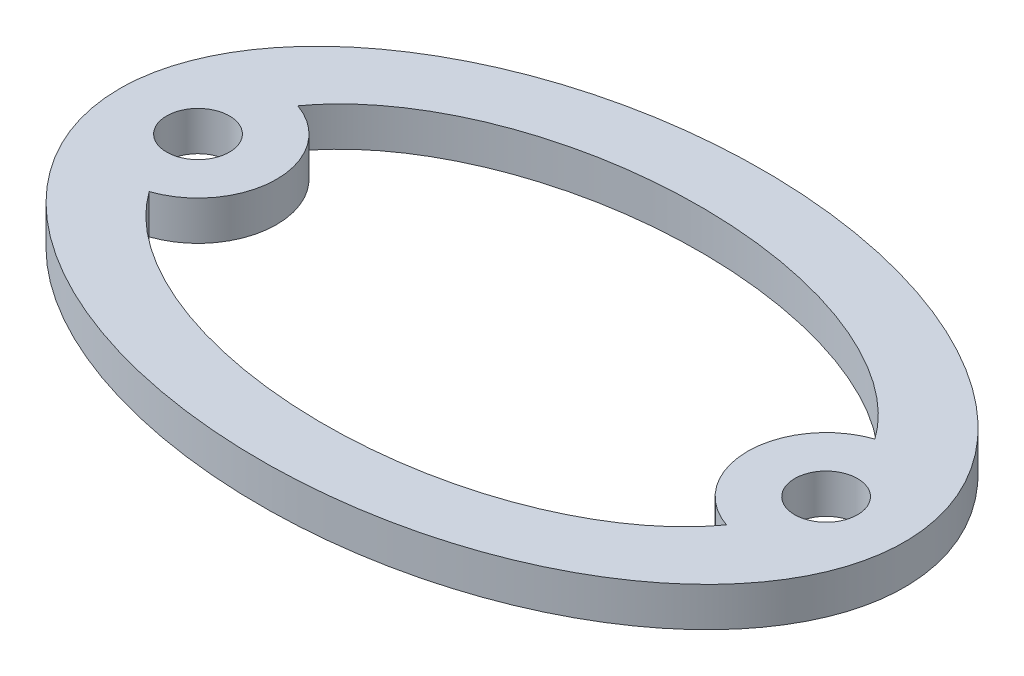
ISO-10303-21;
HEADER;
FILE_DESCRIPTION(('STEP AP214'),'2;1');
FILE_NAME('part.step','',(''),(''),'','','');
FILE_SCHEMA(('AUTOMOTIVE_DESIGN { 1 0 10303 214 1 1 1 1 }'));
ENDSEC;
DATA;
#1=APPLICATION_CONTEXT('core data for automotive mechanical design processes');
#2=APPLICATION_PROTOCOL_DEFINITION('international standard','automotive_design',2000,#1);
#3=PRODUCT_CONTEXT('',#1,'mechanical');
#4=PRODUCT('Part','Part','',(#3));
#5=PRODUCT_RELATED_PRODUCT_CATEGORY('part','',(#4));
#6=PRODUCT_DEFINITION_FORMATION('','',#4);
#7=PRODUCT_DEFINITION_CONTEXT('part definition',#1,'design');
#8=PRODUCT_DEFINITION('design','',#6,#7);
#9=PRODUCT_DEFINITION_SHAPE('','',#8);
#10=(LENGTH_UNIT() NAMED_UNIT(*) SI_UNIT(.MILLI.,.METRE.));
#11=(NAMED_UNIT(*) PLANE_ANGLE_UNIT() SI_UNIT($,.RADIAN.));
#12=(NAMED_UNIT(*) SI_UNIT($,.STERADIAN.) SOLID_ANGLE_UNIT());
#13=UNCERTAINTY_MEASURE_WITH_UNIT(LENGTH_MEASURE(1.E-05),#10,'distance_accuracy_value','');
#14=(GEOMETRIC_REPRESENTATION_CONTEXT(3) GLOBAL_UNCERTAINTY_ASSIGNED_CONTEXT((#13)) GLOBAL_UNIT_ASSIGNED_CONTEXT((#10,
#11,#12)) REPRESENTATION_CONTEXT('',''));
#15=CARTESIAN_POINT('',(0.,0.,0.));
#16=DIRECTION('',(0.,0.,1.));
#17=DIRECTION('',(1.,0.,0.));
#18=AXIS2_PLACEMENT_3D('',#15,#16,#17);
#19=CARTESIAN_POINT('',(0.,2.5,0.));
#20=DIRECTION('',(0.,1.,0.));
#21=DIRECTION('',(1.,0.,0.));
#22=AXIS2_PLACEMENT_3D('',#19,#20,#21);
#23=ELLIPSE('',#22,20.,12.);
#24=DIRECTION('',(0.,-1.,0.));
#25=VECTOR('',#24,1.);
#26=SURFACE_OF_LINEAR_EXTRUSION('',#23,#25);
#27=CARTESIAN_POINT('',(0.,0.,0.));
#28=DIRECTION('',(0.,1.,0.));
#29=DIRECTION('',(1.,0.,0.));
#30=AXIS2_PLACEMENT_3D('',#27,#28,#29);
#31=ELLIPSE('',#30,20.,12.);
#32=CARTESIAN_POINT('',(18.3804623237662,0.,-4.7304437123022));
#33=VERTEX_POINT('',#32);
#34=CARTESIAN_POINT('',(-18.3804623237662,0.,-4.7304437123022));
#35=VERTEX_POINT('',#34);
#36=EDGE_CURVE('E139',#33,#35,#31,.T.);
#37=ORIENTED_EDGE('',*,*,#36,.F.);
#38=DIRECTION('',(0.,-1.,0.));
#39=VECTOR('',#38,1.);
#40=CARTESIAN_POINT('',(18.3804623237662,2.5,-4.7304437123022));
#41=LINE('',#40,#39);
#42=CARTESIAN_POINT('',(18.3804623237662,2.5,-4.7304437123022));
#43=VERTEX_POINT('',#42);
#44=EDGE_CURVE('E11',#43,#33,#41,.T.);
#45=ORIENTED_EDGE('',*,*,#44,.F.);
#46=CARTESIAN_POINT('',(-18.3804623237662,2.5,-4.7304437123022));
#47=VERTEX_POINT('',#46);
#48=EDGE_CURVE('E90',#43,#47,#23,.T.);
#49=ORIENTED_EDGE('',*,*,#48,.T.);
#50=DIRECTION('',(0.,-1.,0.));
#51=VECTOR('',#50,1.);
#52=CARTESIAN_POINT('',(-18.3804623237662,2.5,-4.7304437123022));
#53=LINE('',#52,#51);
#54=EDGE_CURVE('E57',#47,#35,#53,.T.);
#55=ORIENTED_EDGE('',*,*,#54,.T.);
#56=EDGE_LOOP('',(#37,#45,#49,#55));
#57=FACE_BOUND('',#56,.T.);
#58=ADVANCED_FACE('F39',(#57),#26,.T.);
#59=CARTESIAN_POINT('',(20.,2.5,0.));
#60=DIRECTION('',(0.,-1.,0.));
#61=DIRECTION('',(0.,0.,-1.));
#62=AXIS2_PLACEMENT_3D('',#59,#60,#61);
#63=CYLINDRICAL_SURFACE('',#62,5.);
#64=CARTESIAN_POINT('',(20.,0.,0.));
#65=DIRECTION('',(0.,1.,0.));
#66=DIRECTION('',(0.,0.,1.));
#67=AXIS2_PLACEMENT_3D('',#64,#65,#66);
#68=CIRCLE('',#67,5.);
#69=CARTESIAN_POINT('',(18.3804623237662,0.,4.7304437123022));
#70=VERTEX_POINT('',#69);
#71=EDGE_CURVE('E96',#33,#70,#68,.T.);
#72=ORIENTED_EDGE('',*,*,#71,.T.);
#73=DIRECTION('',(0.,-1.,0.));
#74=VECTOR('',#73,1.);
#75=CARTESIAN_POINT('',(18.3804623237662,2.5,4.7304437123022));
#76=LINE('',#75,#74);
#77=CARTESIAN_POINT('',(18.3804623237662,2.5,4.7304437123022));
#78=VERTEX_POINT('',#77);
#79=EDGE_CURVE('E49',#78,#70,#76,.T.);
#80=ORIENTED_EDGE('',*,*,#79,.F.);
#81=CARTESIAN_POINT('',(20.,2.5,0.));
#82=DIRECTION('',(0.,1.,0.));
#83=DIRECTION('',(0.,0.,1.));
#84=AXIS2_PLACEMENT_3D('',#81,#82,#83);
#85=CIRCLE('',#84,5.);
#86=EDGE_CURVE('E83',#43,#78,#85,.T.);
#87=ORIENTED_EDGE('',*,*,#86,.F.);
#88=ORIENTED_EDGE('',*,*,#44,.T.);
#89=EDGE_LOOP('',(#72,#80,#87,#88));
#90=FACE_BOUND('',#89,.T.);
#91=ADVANCED_FACE('F41',(#90),#63,.T.);
#92=CARTESIAN_POINT('',(-18.3804623237662,0.,4.7304437123022));
#93=VERTEX_POINT('',#92);
#94=EDGE_CURVE('E169',#93,#70,#31,.T.);
#95=ORIENTED_EDGE('',*,*,#94,.F.);
#96=DIRECTION('',(0.,-1.,0.));
#97=VECTOR('',#96,1.);
#98=CARTESIAN_POINT('',(-18.3804623237662,2.5,4.7304437123022));
#99=LINE('',#98,#97);
#100=CARTESIAN_POINT('',(-18.3804623237662,2.5,4.7304437123022));
#101=VERTEX_POINT('',#100);
#102=EDGE_CURVE('E70',#101,#93,#99,.T.);
#103=ORIENTED_EDGE('',*,*,#102,.F.);
#104=EDGE_CURVE('E89',#101,#78,#23,.T.);
#105=ORIENTED_EDGE('',*,*,#104,.T.);
#106=ORIENTED_EDGE('',*,*,#79,.T.);
#107=EDGE_LOOP('',(#95,#103,#105,#106));
#108=FACE_BOUND('',#107,.T.);
#109=ADVANCED_FACE('F100',(#108),#26,.T.);
#110=CARTESIAN_POINT('',(20.,2.5,0.));
#111=DIRECTION('',(0.,-1.,0.));
#112=DIRECTION('',(0.,0.,-1.));
#113=AXIS2_PLACEMENT_3D('',#110,#111,#112);
#114=CYLINDRICAL_SURFACE('',#113,2.);
#115=CARTESIAN_POINT('',(20.,2.5,0.));
#116=DIRECTION('',(0.,1.,0.));
#117=DIRECTION('',(0.,0.,1.));
#118=AXIS2_PLACEMENT_3D('',#115,#116,#117);
#119=CIRCLE('',#118,2.);
#120=CARTESIAN_POINT('',(20.,2.5,2.));
#121=VERTEX_POINT('',#120);
#122=EDGE_CURVE('E129',#121,#121,#119,.T.);
#123=ORIENTED_EDGE('',*,*,#122,.T.);
#124=EDGE_LOOP('',(#123));
#125=FACE_BOUND('',#124,.T.);
#126=CARTESIAN_POINT('',(20.,0.,0.));
#127=DIRECTION('',(0.,1.,0.));
#128=DIRECTION('',(0.,0.,1.));
#129=AXIS2_PLACEMENT_3D('',#126,#127,#128);
#130=CIRCLE('',#129,2.);
#131=CARTESIAN_POINT('',(20.,0.,2.));
#132=VERTEX_POINT('',#131);
#133=EDGE_CURVE('E112',#132,#132,#130,.T.);
#134=ORIENTED_EDGE('',*,*,#133,.F.);
#135=EDGE_LOOP('',(#134));
#136=FACE_BOUND('',#135,.T.);
#137=ADVANCED_FACE('F150',(#125,#136),#114,.F.);
#138=CARTESIAN_POINT('',(-20.,2.5,0.));
#139=DIRECTION('',(0.,-1.,0.));
#140=DIRECTION('',(0.,0.,-1.));
#141=AXIS2_PLACEMENT_3D('',#138,#139,#140);
#142=CYLINDRICAL_SURFACE('',#141,2.);
#143=CARTESIAN_POINT('',(-20.,2.5,0.));
#144=DIRECTION('',(0.,1.,0.));
#145=DIRECTION('',(0.,0.,1.));
#146=AXIS2_PLACEMENT_3D('',#143,#144,#145);
#147=CIRCLE('',#146,2.);
#148=CARTESIAN_POINT('',(-20.,2.5,2.));
#149=VERTEX_POINT('',#148);
#150=EDGE_CURVE('E105',#149,#149,#147,.F.);
#151=ORIENTED_EDGE('',*,*,#150,.F.);
#152=EDGE_LOOP('',(#151));
#153=FACE_BOUND('',#152,.T.);
#154=CARTESIAN_POINT('',(-20.,0.,0.));
#155=DIRECTION('',(0.,1.,0.));
#156=DIRECTION('',(0.,0.,1.));
#157=AXIS2_PLACEMENT_3D('',#154,#155,#156);
#158=CIRCLE('',#157,2.);
#159=CARTESIAN_POINT('',(-20.,0.,2.));
#160=VERTEX_POINT('',#159);
#161=EDGE_CURVE('E118',#160,#160,#158,.F.);
#162=ORIENTED_EDGE('',*,*,#161,.T.);
#163=EDGE_LOOP('',(#162));
#164=FACE_BOUND('',#163,.T.);
#165=ADVANCED_FACE('F153',(#153,#164),#142,.F.);
#166=CARTESIAN_POINT('',(-20.,2.5,0.));
#167=DIRECTION('',(0.,-1.,0.));
#168=DIRECTION('',(0.,0.,-1.));
#169=AXIS2_PLACEMENT_3D('',#166,#167,#168);
#170=CYLINDRICAL_SURFACE('',#169,5.);
#171=CARTESIAN_POINT('',(-20.,0.,0.));
#172=DIRECTION('',(0.,1.,0.));
#173=DIRECTION('',(0.,0.,1.));
#174=AXIS2_PLACEMENT_3D('',#171,#172,#173);
#175=CIRCLE('',#174,5.);
#176=EDGE_CURVE('E172',#35,#93,#175,.F.);
#177=ORIENTED_EDGE('',*,*,#176,.F.);
#178=ORIENTED_EDGE('',*,*,#54,.F.);
#179=CARTESIAN_POINT('',(-20.,2.5,0.));
#180=DIRECTION('',(0.,1.,0.));
#181=DIRECTION('',(0.,0.,1.));
#182=AXIS2_PLACEMENT_3D('',#179,#180,#181);
#183=CIRCLE('',#182,5.);
#184=EDGE_CURVE('E102',#47,#101,#183,.F.);
#185=ORIENTED_EDGE('',*,*,#184,.T.);
#186=ORIENTED_EDGE('',*,*,#102,.T.);
#187=EDGE_LOOP('',(#177,#178,#185,#186));
#188=FACE_BOUND('',#187,.T.);
#189=ADVANCED_FACE('F146',(#188),#170,.T.);
#190=CARTESIAN_POINT('',(0.,2.5,0.));
#191=DIRECTION('',(0.,1.,0.));
#192=DIRECTION('',(-1.,0.,0.));
#193=AXIS2_PLACEMENT_3D('',#190,#191,#192);
#194=ELLIPSE('',#193,25.,16.);
#195=DIRECTION('',(0.,-1.,0.));
#196=VECTOR('',#195,1.);
#197=SURFACE_OF_LINEAR_EXTRUSION('',#194,#196);
#198=CARTESIAN_POINT('',(-25.,2.5,0.));
#199=VERTEX_POINT('',#198);
#200=EDGE_CURVE('E124',#199,#199,#194,.T.);
#201=ORIENTED_EDGE('',*,*,#200,.F.);
#202=EDGE_LOOP('',(#201));
#203=FACE_BOUND('',#202,.T.);
#204=CARTESIAN_POINT('',(0.,0.,0.));
#205=DIRECTION('',(0.,1.,0.));
#206=DIRECTION('',(-1.,0.,0.));
#207=AXIS2_PLACEMENT_3D('',#204,#205,#206);
#208=ELLIPSE('',#207,25.,16.);
#209=CARTESIAN_POINT('',(-25.,0.,0.));
#210=VERTEX_POINT('',#209);
#211=EDGE_CURVE('E109',#210,#210,#208,.T.);
#212=ORIENTED_EDGE('',*,*,#211,.T.);
#213=EDGE_LOOP('',(#212));
#214=FACE_BOUND('',#213,.T.);
#215=ADVANCED_FACE('F142',(#203,#214),#197,.F.);
#216=CARTESIAN_POINT('',(0.,2.5,0.));
#217=DIRECTION('',(0.,1.,0.));
#218=DIRECTION('',(0.,0.,1.));
#219=AXIS2_PLACEMENT_3D('',#216,#217,#218);
#220=PLANE('',#219);
#221=ORIENTED_EDGE('',*,*,#48,.F.);
#222=ORIENTED_EDGE('',*,*,#86,.T.);
#223=ORIENTED_EDGE('',*,*,#104,.F.);
#224=ORIENTED_EDGE('',*,*,#184,.F.);
#225=EDGE_LOOP('',(#221,#222,#223,#224));
#226=FACE_BOUND('',#225,.T.);
#227=ORIENTED_EDGE('',*,*,#150,.T.);
#228=EDGE_LOOP('',(#227));
#229=FACE_BOUND('',#228,.T.);
#230=ORIENTED_EDGE('',*,*,#122,.F.);
#231=EDGE_LOOP('',(#230));
#232=FACE_BOUND('',#231,.T.);
#233=ORIENTED_EDGE('',*,*,#200,.T.);
#234=EDGE_LOOP('',(#233));
#235=FACE_BOUND('',#234,.T.);
#236=ADVANCED_FACE('F85',(#226,#229,#232,#235),#220,.T.);
#237=CARTESIAN_POINT('',(0.,0.,0.));
#238=DIRECTION('',(0.,1.,0.));
#239=DIRECTION('',(0.,0.,1.));
#240=AXIS2_PLACEMENT_3D('',#237,#238,#239);
#241=PLANE('',#240);
#242=ORIENTED_EDGE('',*,*,#36,.T.);
#243=ORIENTED_EDGE('',*,*,#176,.T.);
#244=ORIENTED_EDGE('',*,*,#94,.T.);
#245=ORIENTED_EDGE('',*,*,#71,.F.);
#246=EDGE_LOOP('',(#242,#243,#244,#245));
#247=FACE_BOUND('',#246,.T.);
#248=ORIENTED_EDGE('',*,*,#161,.F.);
#249=EDGE_LOOP('',(#248));
#250=FACE_BOUND('',#249,.T.);
#251=ORIENTED_EDGE('',*,*,#133,.T.);
#252=EDGE_LOOP('',(#251));
#253=FACE_BOUND('',#252,.T.);
#254=ORIENTED_EDGE('',*,*,#211,.F.);
#255=EDGE_LOOP('',(#254));
#256=FACE_BOUND('',#255,.T.);
#257=ADVANCED_FACE('F148',(#247,#250,#253,#256),#241,.F.);
#258=CLOSED_SHELL('',(#58,#91,#109,#137,#165,#189,#215,#236,#257));
#259=MANIFOLD_SOLID_BREP('B2',#258);
#260=ADVANCED_BREP_SHAPE_REPRESENTATION('',(#18,#259),#14);
#261=SHAPE_DEFINITION_REPRESENTATION(#9,#260);
ENDSEC;
END-ISO-10303-21;
